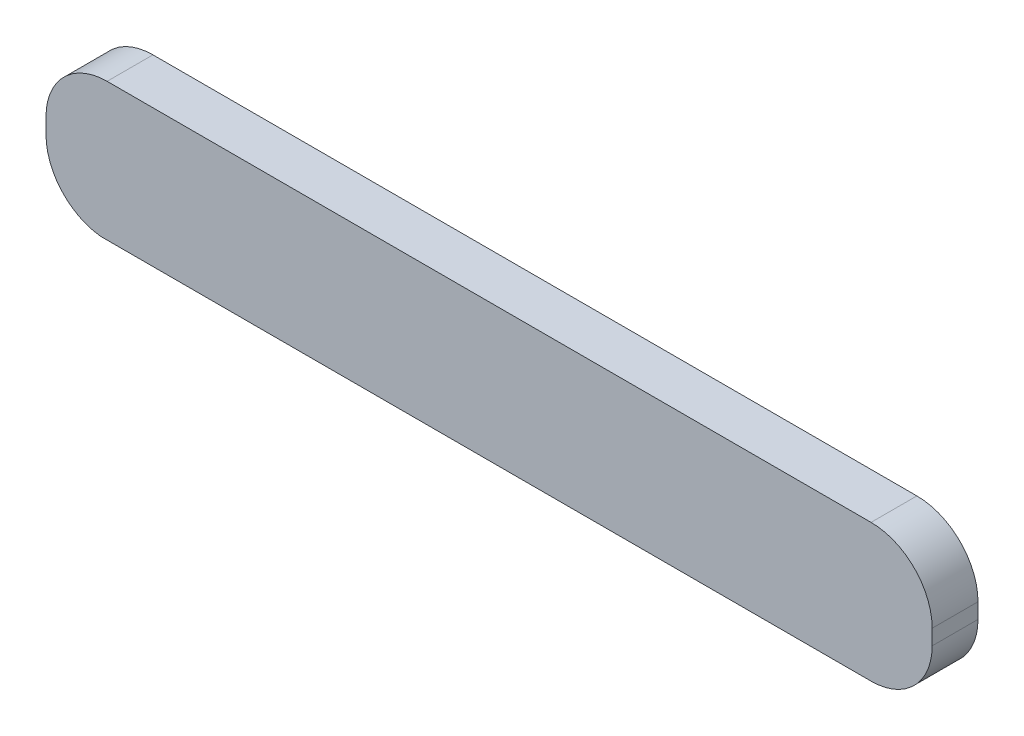
ISO-10303-21;
HEADER;
FILE_DESCRIPTION(('STEP AP214'),'2;1');
FILE_NAME('part.step','',(''),(''),'','','');
FILE_SCHEMA(('AUTOMOTIVE_DESIGN { 1 0 10303 214 1 1 1 1 }'));
ENDSEC;
DATA;
#1=APPLICATION_CONTEXT('core data for automotive mechanical design processes');
#2=APPLICATION_PROTOCOL_DEFINITION('international standard','automotive_design',2000,#1);
#3=PRODUCT_CONTEXT('',#1,'mechanical');
#4=PRODUCT('Part','Part','',(#3));
#5=PRODUCT_RELATED_PRODUCT_CATEGORY('part','',(#4));
#6=PRODUCT_DEFINITION_FORMATION('','',#4);
#7=PRODUCT_DEFINITION_CONTEXT('part definition',#1,'design');
#8=PRODUCT_DEFINITION('design','',#6,#7);
#9=PRODUCT_DEFINITION_SHAPE('','',#8);
#10=(LENGTH_UNIT() NAMED_UNIT(*) SI_UNIT(.MILLI.,.METRE.));
#11=(NAMED_UNIT(*) PLANE_ANGLE_UNIT() SI_UNIT($,.RADIAN.));
#12=(NAMED_UNIT(*) SI_UNIT($,.STERADIAN.) SOLID_ANGLE_UNIT());
#13=UNCERTAINTY_MEASURE_WITH_UNIT(LENGTH_MEASURE(1.E-05),#10,'distance_accuracy_value','');
#14=(GEOMETRIC_REPRESENTATION_CONTEXT(3) GLOBAL_UNCERTAINTY_ASSIGNED_CONTEXT((#13)) GLOBAL_UNIT_ASSIGNED_CONTEXT((#10,
#11,#12)) REPRESENTATION_CONTEXT('',''));
#15=CARTESIAN_POINT('',(0.,0.,0.));
#16=DIRECTION('',(0.,0.,1.));
#17=DIRECTION('',(1.,0.,0.));
#18=AXIS2_PLACEMENT_3D('',#15,#16,#17);
#19=CARTESIAN_POINT('',(225.,-2.49999999999997,15.));
#20=DIRECTION('',(0.,0.,-1.));
#21=DIRECTION('',(-1.,0.,0.));
#22=AXIS2_PLACEMENT_3D('',#19,#20,#21);
#23=CYLINDRICAL_SURFACE('',#22,20.);
#24=CARTESIAN_POINT('',(225.,-2.49999999999997,0.));
#25=DIRECTION('',(0.,0.,-1.));
#26=DIRECTION('',(-1.,0.,0.));
#27=AXIS2_PLACEMENT_3D('',#24,#25,#26);
#28=CIRCLE('',#27,20.);
#29=CARTESIAN_POINT('',(245.,-2.49999999999997,0.));
#30=VERTEX_POINT('',#29);
#31=CARTESIAN_POINT('',(225.,-22.5,0.));
#32=VERTEX_POINT('',#31);
#33=EDGE_CURVE('E134',#30,#32,#28,.T.);
#34=ORIENTED_EDGE('',*,*,#33,.F.);
#35=DIRECTION('',(0.,0.,-1.));
#36=VECTOR('',#35,1.);
#37=CARTESIAN_POINT('',(245.,-2.49999999999997,15.));
#38=LINE('',#37,#36);
#39=CARTESIAN_POINT('',(245.,-2.49999999999997,15.));
#40=VERTEX_POINT('',#39);
#41=EDGE_CURVE('E11',#40,#30,#38,.T.);
#42=ORIENTED_EDGE('',*,*,#41,.F.);
#43=CARTESIAN_POINT('',(225.,-2.49999999999997,15.));
#44=DIRECTION('',(0.,0.,-1.));
#45=DIRECTION('',(-1.,0.,0.));
#46=AXIS2_PLACEMENT_3D('',#43,#44,#45);
#47=CIRCLE('',#46,20.);
#48=CARTESIAN_POINT('',(225.,-22.5,15.));
#49=VERTEX_POINT('',#48);
#50=EDGE_CURVE('E154',#40,#49,#47,.T.);
#51=ORIENTED_EDGE('',*,*,#50,.T.);
#52=DIRECTION('',(0.,0.,-1.));
#53=VECTOR('',#52,1.);
#54=CARTESIAN_POINT('',(225.,-22.5,15.));
#55=LINE('',#54,#53);
#56=EDGE_CURVE('E40',#49,#32,#55,.T.);
#57=ORIENTED_EDGE('',*,*,#56,.T.);
#58=EDGE_LOOP('',(#34,#42,#51,#57));
#59=FACE_BOUND('',#58,.T.);
#60=ADVANCED_FACE('F37',(#59),#23,.T.);
#61=CARTESIAN_POINT('',(245.,2.5,15.));
#62=DIRECTION('',(1.,0.,0.));
#63=DIRECTION('',(0.,1.,0.));
#64=AXIS2_PLACEMENT_3D('',#61,#62,#63);
#65=PLANE('',#64);
#66=DIRECTION('',(0.,-1.,0.));
#67=VECTOR('',#66,1.);
#68=CARTESIAN_POINT('',(245.,2.5,0.));
#69=LINE('',#68,#67);
#70=CARTESIAN_POINT('',(245.,2.5,0.));
#71=VERTEX_POINT('',#70);
#72=EDGE_CURVE('E152',#71,#30,#69,.T.);
#73=ORIENTED_EDGE('',*,*,#72,.F.);
#74=DIRECTION('',(0.,0.,-1.));
#75=VECTOR('',#74,1.);
#76=CARTESIAN_POINT('',(245.,2.5,15.));
#77=LINE('',#76,#75);
#78=CARTESIAN_POINT('',(245.,2.5,15.));
#79=VERTEX_POINT('',#78);
#80=EDGE_CURVE('E46',#79,#71,#77,.T.);
#81=ORIENTED_EDGE('',*,*,#80,.F.);
#82=DIRECTION('',(0.,-1.,0.));
#83=VECTOR('',#82,1.);
#84=CARTESIAN_POINT('',(245.,2.5,15.));
#85=LINE('',#84,#83);
#86=EDGE_CURVE('E124',#79,#40,#85,.T.);
#87=ORIENTED_EDGE('',*,*,#86,.T.);
#88=ORIENTED_EDGE('',*,*,#41,.T.);
#89=EDGE_LOOP('',(#73,#81,#87,#88));
#90=FACE_BOUND('',#89,.T.);
#91=ADVANCED_FACE('F167',(#90),#65,.T.);
#92=CARTESIAN_POINT('',(225.,2.5,15.));
#93=DIRECTION('',(0.,0.,-1.));
#94=DIRECTION('',(-1.,0.,0.));
#95=AXIS2_PLACEMENT_3D('',#92,#93,#94);
#96=CYLINDRICAL_SURFACE('',#95,20.);
#97=CARTESIAN_POINT('',(225.,2.5,0.));
#98=DIRECTION('',(0.,0.,-1.));
#99=DIRECTION('',(-1.,0.,0.));
#100=AXIS2_PLACEMENT_3D('',#97,#98,#99);
#101=CIRCLE('',#100,20.);
#102=CARTESIAN_POINT('',(225.,22.5,0.));
#103=VERTEX_POINT('',#102);
#104=EDGE_CURVE('E111',#103,#71,#101,.T.);
#105=ORIENTED_EDGE('',*,*,#104,.F.);
#106=DIRECTION('',(0.,0.,-1.));
#107=VECTOR('',#106,1.);
#108=CARTESIAN_POINT('',(225.,22.5,15.));
#109=LINE('',#108,#107);
#110=CARTESIAN_POINT('',(225.,22.5,15.));
#111=VERTEX_POINT('',#110);
#112=EDGE_CURVE('E106',#111,#103,#109,.T.);
#113=ORIENTED_EDGE('',*,*,#112,.F.);
#114=CARTESIAN_POINT('',(225.,2.5,15.));
#115=DIRECTION('',(0.,0.,-1.));
#116=DIRECTION('',(-1.,0.,0.));
#117=AXIS2_PLACEMENT_3D('',#114,#115,#116);
#118=CIRCLE('',#117,20.);
#119=EDGE_CURVE('E109',#111,#79,#118,.T.);
#120=ORIENTED_EDGE('',*,*,#119,.T.);
#121=ORIENTED_EDGE('',*,*,#80,.T.);
#122=EDGE_LOOP('',(#105,#113,#120,#121));
#123=FACE_BOUND('',#122,.T.);
#124=ADVANCED_FACE('F108',(#123),#96,.T.);
#125=CARTESIAN_POINT('',(-25.,22.5,15.));
#126=DIRECTION('',(0.,1.,0.));
#127=DIRECTION('',(-1.,0.,0.));
#128=AXIS2_PLACEMENT_3D('',#125,#126,#127);
#129=PLANE('',#128);
#130=DIRECTION('',(1.,0.,0.));
#131=VECTOR('',#130,1.);
#132=CARTESIAN_POINT('',(-25.,22.5,0.));
#133=LINE('',#132,#131);
#134=CARTESIAN_POINT('',(-25.,22.5,0.));
#135=VERTEX_POINT('',#134);
#136=EDGE_CURVE('E149',#135,#103,#133,.T.);
#137=ORIENTED_EDGE('',*,*,#136,.F.);
#138=DIRECTION('',(0.,0.,-1.));
#139=VECTOR('',#138,1.);
#140=CARTESIAN_POINT('',(-25.,22.5,15.));
#141=LINE('',#140,#139);
#142=CARTESIAN_POINT('',(-25.,22.5,15.));
#143=VERTEX_POINT('',#142);
#144=EDGE_CURVE('E116',#143,#135,#141,.T.);
#145=ORIENTED_EDGE('',*,*,#144,.F.);
#146=DIRECTION('',(1.,0.,0.));
#147=VECTOR('',#146,1.);
#148=CARTESIAN_POINT('',(-25.,22.5,15.));
#149=LINE('',#148,#147);
#150=EDGE_CURVE('E122',#143,#111,#149,.T.);
#151=ORIENTED_EDGE('',*,*,#150,.T.);
#152=ORIENTED_EDGE('',*,*,#112,.T.);
#153=EDGE_LOOP('',(#137,#145,#151,#152));
#154=FACE_BOUND('',#153,.T.);
#155=ADVANCED_FACE('F126',(#154),#129,.T.);
#156=CARTESIAN_POINT('',(-25.,2.5,15.));
#157=DIRECTION('',(0.,0.,-1.));
#158=DIRECTION('',(-1.,0.,0.));
#159=AXIS2_PLACEMENT_3D('',#156,#157,#158);
#160=CYLINDRICAL_SURFACE('',#159,20.);
#161=CARTESIAN_POINT('',(-25.,2.5,0.));
#162=DIRECTION('',(0.,0.,-1.));
#163=DIRECTION('',(-1.,0.,0.));
#164=AXIS2_PLACEMENT_3D('',#161,#162,#163);
#165=CIRCLE('',#164,20.);
#166=CARTESIAN_POINT('',(-45.,2.5,0.));
#167=VERTEX_POINT('',#166);
#168=EDGE_CURVE('E146',#167,#135,#165,.T.);
#169=ORIENTED_EDGE('',*,*,#168,.F.);
#170=DIRECTION('',(0.,0.,-1.));
#171=VECTOR('',#170,1.);
#172=CARTESIAN_POINT('',(-45.,2.5,15.));
#173=LINE('',#172,#171);
#174=CARTESIAN_POINT('',(-45.,2.5,15.));
#175=VERTEX_POINT('',#174);
#176=EDGE_CURVE('E158',#175,#167,#173,.T.);
#177=ORIENTED_EDGE('',*,*,#176,.F.);
#178=CARTESIAN_POINT('',(-25.,2.5,15.));
#179=DIRECTION('',(0.,0.,-1.));
#180=DIRECTION('',(-1.,0.,0.));
#181=AXIS2_PLACEMENT_3D('',#178,#179,#180);
#182=CIRCLE('',#181,20.);
#183=EDGE_CURVE('E127',#175,#143,#182,.T.);
#184=ORIENTED_EDGE('',*,*,#183,.T.);
#185=ORIENTED_EDGE('',*,*,#144,.T.);
#186=EDGE_LOOP('',(#169,#177,#184,#185));
#187=FACE_BOUND('',#186,.T.);
#188=ADVANCED_FACE('F180',(#187),#160,.T.);
#189=CARTESIAN_POINT('',(-45.,-2.61486936049103,15.));
#190=DIRECTION('',(-1.,0.,0.));
#191=DIRECTION('',(0.,0.,1.));
#192=AXIS2_PLACEMENT_3D('',#189,#190,#191);
#193=PLANE('',#192);
#194=DIRECTION('',(0.,1.,0.));
#195=VECTOR('',#194,1.);
#196=CARTESIAN_POINT('',(-45.,-2.61486936049103,0.));
#197=LINE('',#196,#195);
#198=CARTESIAN_POINT('',(-45.,-2.61486936049103,0.));
#199=VERTEX_POINT('',#198);
#200=EDGE_CURVE('E143',#199,#167,#197,.T.);
#201=ORIENTED_EDGE('',*,*,#200,.F.);
#202=DIRECTION('',(0.,0.,-1.));
#203=VECTOR('',#202,1.);
#204=CARTESIAN_POINT('',(-45.,-2.61486936049103,15.));
#205=LINE('',#204,#203);
#206=CARTESIAN_POINT('',(-45.,-2.61486936049103,15.));
#207=VERTEX_POINT('',#206);
#208=EDGE_CURVE('E160',#207,#199,#205,.T.);
#209=ORIENTED_EDGE('',*,*,#208,.F.);
#210=DIRECTION('',(0.,1.,0.));
#211=VECTOR('',#210,1.);
#212=CARTESIAN_POINT('',(-45.,-2.61486936049103,15.));
#213=LINE('',#212,#211);
#214=EDGE_CURVE('E129',#207,#175,#213,.T.);
#215=ORIENTED_EDGE('',*,*,#214,.T.);
#216=ORIENTED_EDGE('',*,*,#176,.T.);
#217=EDGE_LOOP('',(#201,#209,#215,#216));
#218=FACE_BOUND('',#217,.T.);
#219=ADVANCED_FACE('F183',(#218),#193,.T.);
#220=CARTESIAN_POINT('',(-25.,-2.61486936049103,15.));
#221=DIRECTION('',(0.,0.,-1.));
#222=DIRECTION('',(-1.,0.,0.));
#223=AXIS2_PLACEMENT_3D('',#220,#221,#222);
#224=CYLINDRICAL_SURFACE('',#223,20.);
#225=CARTESIAN_POINT('',(-25.,-2.61486936049103,0.));
#226=DIRECTION('',(0.,0.,1.));
#227=DIRECTION('',(1.,0.,0.));
#228=AXIS2_PLACEMENT_3D('',#225,#226,#227);
#229=CIRCLE('',#228,20.);
#230=CARTESIAN_POINT('',(-27.1404624382739,-22.5,0.));
#231=VERTEX_POINT('',#230);
#232=EDGE_CURVE('E140',#199,#231,#229,.T.);
#233=ORIENTED_EDGE('',*,*,#232,.T.);
#234=DIRECTION('',(0.,0.,-1.));
#235=VECTOR('',#234,1.);
#236=CARTESIAN_POINT('',(-27.1404624382739,-22.5,15.));
#237=LINE('',#236,#235);
#238=CARTESIAN_POINT('',(-27.1404624382739,-22.5,15.));
#239=VERTEX_POINT('',#238);
#240=EDGE_CURVE('E161',#239,#231,#237,.T.);
#241=ORIENTED_EDGE('',*,*,#240,.F.);
#242=CARTESIAN_POINT('',(-25.,-2.61486936049103,15.));
#243=DIRECTION('',(0.,0.,1.));
#244=DIRECTION('',(1.,0.,0.));
#245=AXIS2_PLACEMENT_3D('',#242,#243,#244);
#246=CIRCLE('',#245,20.);
#247=EDGE_CURVE('E277',#207,#239,#246,.T.);
#248=ORIENTED_EDGE('',*,*,#247,.F.);
#249=ORIENTED_EDGE('',*,*,#208,.T.);
#250=EDGE_LOOP('',(#233,#241,#248,#249));
#251=FACE_BOUND('',#250,.T.);
#252=ADVANCED_FACE('F187',(#251),#224,.T.);
#253=CARTESIAN_POINT('',(225.,-22.5,15.));
#254=DIRECTION('',(0.,-1.,0.));
#255=DIRECTION('',(1.,0.,0.));
#256=AXIS2_PLACEMENT_3D('',#253,#254,#255);
#257=PLANE('',#256);
#258=DIRECTION('',(-1.,0.,0.));
#259=VECTOR('',#258,1.);
#260=CARTESIAN_POINT('',(225.,-22.5,0.));
#261=LINE('',#260,#259);
#262=EDGE_CURVE('E137',#32,#231,#261,.T.);
#263=ORIENTED_EDGE('',*,*,#262,.F.);
#264=ORIENTED_EDGE('',*,*,#56,.F.);
#265=DIRECTION('',(-1.,0.,0.));
#266=VECTOR('',#265,1.);
#267=CARTESIAN_POINT('',(225.,-22.5,15.));
#268=LINE('',#267,#266);
#269=EDGE_CURVE('E278',#49,#239,#268,.T.);
#270=ORIENTED_EDGE('',*,*,#269,.T.);
#271=ORIENTED_EDGE('',*,*,#240,.T.);
#272=EDGE_LOOP('',(#263,#264,#270,#271));
#273=FACE_BOUND('',#272,.T.);
#274=ADVANCED_FACE('F163',(#273),#257,.T.);
#275=CARTESIAN_POINT('',(225.,-2.49999999999997,15.));
#276=DIRECTION('',(0.,0.,-1.));
#277=DIRECTION('',(-1.,0.,0.));
#278=AXIS2_PLACEMENT_3D('',#275,#276,#277);
#279=PLANE('',#278);
#280=ORIENTED_EDGE('',*,*,#50,.F.);
#281=ORIENTED_EDGE('',*,*,#86,.F.);
#282=ORIENTED_EDGE('',*,*,#119,.F.);
#283=ORIENTED_EDGE('',*,*,#150,.F.);
#284=ORIENTED_EDGE('',*,*,#183,.F.);
#285=ORIENTED_EDGE('',*,*,#214,.F.);
#286=ORIENTED_EDGE('',*,*,#247,.T.);
#287=ORIENTED_EDGE('',*,*,#269,.F.);
#288=EDGE_LOOP('',(#280,#281,#282,#283,#284,#285,#286,#287));
#289=FACE_BOUND('',#288,.T.);
#290=ADVANCED_FACE('F120',(#289),#279,.F.);
#291=CARTESIAN_POINT('',(225.,-2.49999999999997,0.));
#292=DIRECTION('',(0.,0.,-1.));
#293=DIRECTION('',(-1.,0.,0.));
#294=AXIS2_PLACEMENT_3D('',#291,#292,#293);
#295=PLANE('',#294);
#296=ORIENTED_EDGE('',*,*,#33,.T.);
#297=ORIENTED_EDGE('',*,*,#262,.T.);
#298=ORIENTED_EDGE('',*,*,#232,.F.);
#299=ORIENTED_EDGE('',*,*,#200,.T.);
#300=ORIENTED_EDGE('',*,*,#168,.T.);
#301=ORIENTED_EDGE('',*,*,#136,.T.);
#302=ORIENTED_EDGE('',*,*,#104,.T.);
#303=ORIENTED_EDGE('',*,*,#72,.T.);
#304=EDGE_LOOP('',(#296,#297,#298,#299,#300,#301,#302,#303));
#305=FACE_BOUND('',#304,.T.);
#306=ADVANCED_FACE('F166',(#305),#295,.T.);
#307=CLOSED_SHELL('',(#60,#91,#124,#155,#188,#219,#252,#274,#290,#306));
#308=MANIFOLD_SOLID_BREP('B2',#307);
#309=ADVANCED_BREP_SHAPE_REPRESENTATION('',(#18,#308),#14);
#310=SHAPE_DEFINITION_REPRESENTATION(#9,#309);
ENDSEC;
END-ISO-10303-21;
